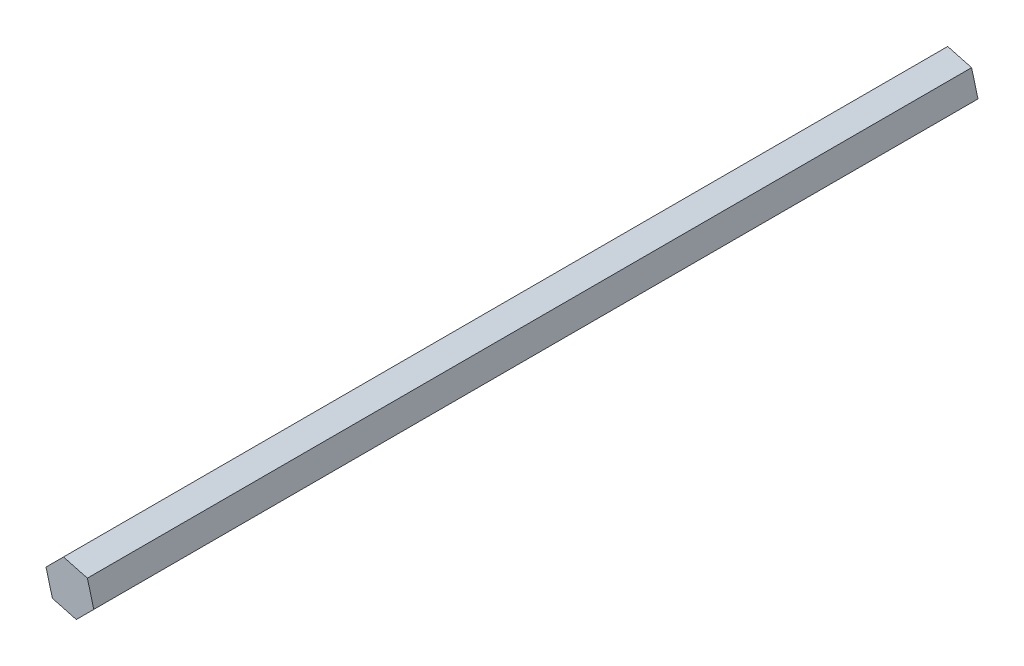
ISO-10303-21;
HEADER;
FILE_DESCRIPTION(('STEP AP214'),'2;1');
FILE_NAME('part.step','',(''),(''),'','','');
FILE_SCHEMA(('AUTOMOTIVE_DESIGN { 1 0 10303 214 1 1 1 1 }'));
ENDSEC;
DATA;
#1=APPLICATION_CONTEXT('core data for automotive mechanical design processes');
#2=APPLICATION_PROTOCOL_DEFINITION('international standard','automotive_design',2000,#1);
#3=PRODUCT_CONTEXT('',#1,'mechanical');
#4=PRODUCT('Part','Part','',(#3));
#5=PRODUCT_RELATED_PRODUCT_CATEGORY('part','',(#4));
#6=PRODUCT_DEFINITION_FORMATION('','',#4);
#7=PRODUCT_DEFINITION_CONTEXT('part definition',#1,'design');
#8=PRODUCT_DEFINITION('design','',#6,#7);
#9=PRODUCT_DEFINITION_SHAPE('','',#8);
#10=(LENGTH_UNIT() NAMED_UNIT(*) SI_UNIT(.MILLI.,.METRE.));
#11=(NAMED_UNIT(*) PLANE_ANGLE_UNIT() SI_UNIT($,.RADIAN.));
#12=(NAMED_UNIT(*) SI_UNIT($,.STERADIAN.) SOLID_ANGLE_UNIT());
#13=UNCERTAINTY_MEASURE_WITH_UNIT(LENGTH_MEASURE(1.E-05),#10,'distance_accuracy_value','');
#14=(GEOMETRIC_REPRESENTATION_CONTEXT(3) GLOBAL_UNCERTAINTY_ASSIGNED_CONTEXT((#13)) GLOBAL_UNIT_ASSIGNED_CONTEXT((#10,
#11,#12)) REPRESENTATION_CONTEXT('',''));
#15=CARTESIAN_POINT('',(0.,0.,0.));
#16=DIRECTION('',(0.,0.,1.));
#17=DIRECTION('',(1.,0.,0.));
#18=AXIS2_PLACEMENT_3D('',#15,#16,#17);
#19=CARTESIAN_POINT('',(3.40295474387526,-12.7,469.9));
#20=DIRECTION('',(-0.707106781186547,0.707106781186548,0.));
#21=DIRECTION('',(-0.707106781186548,-0.707106781186547,0.));
#22=AXIS2_PLACEMENT_3D('',#19,#20,#21);
#23=PLANE('',#22);
#24=DIRECTION('',(0.707106781186548,0.707106781186547,0.));
#25=VECTOR('',#24,1.);
#26=CARTESIAN_POINT('',(3.40295474387526,-12.7,0.));
#27=LINE('',#26,#25);
#28=CARTESIAN_POINT('',(3.40295474387526,-12.7,0.));
#29=VERTEX_POINT('',#28);
#30=CARTESIAN_POINT('',(12.7,-3.40295474387526,0.));
#31=VERTEX_POINT('',#30);
#32=EDGE_CURVE('E117',#29,#31,#27,.T.);
#33=ORIENTED_EDGE('',*,*,#32,.T.);
#34=DIRECTION('',(0.,0.,-1.));
#35=VECTOR('',#34,1.);
#36=CARTESIAN_POINT('',(12.7,-3.40295474387526,469.9));
#37=LINE('',#36,#35);
#38=CARTESIAN_POINT('',(12.7,-3.40295474387526,469.9));
#39=VERTEX_POINT('',#38);
#40=EDGE_CURVE('E11',#39,#31,#37,.T.);
#41=ORIENTED_EDGE('',*,*,#40,.F.);
#42=DIRECTION('',(0.707106781186548,0.707106781186547,0.));
#43=VECTOR('',#42,1.);
#44=CARTESIAN_POINT('',(3.40295474387526,-12.7,469.9));
#45=LINE('',#44,#43);
#46=CARTESIAN_POINT('',(3.40295474387526,-12.7,469.9));
#47=VERTEX_POINT('',#46);
#48=EDGE_CURVE('E127',#47,#39,#45,.T.);
#49=ORIENTED_EDGE('',*,*,#48,.F.);
#50=DIRECTION('',(0.,0.,-1.));
#51=VECTOR('',#50,1.);
#52=CARTESIAN_POINT('',(3.40295474387526,-12.7,469.9));
#53=LINE('',#52,#51);
#54=EDGE_CURVE('E113',#47,#29,#53,.T.);
#55=ORIENTED_EDGE('',*,*,#54,.T.);
#56=EDGE_LOOP('',(#33,#41,#49,#55));
#57=FACE_BOUND('',#56,.T.);
#58=ADVANCED_FACE('F33',(#57),#23,.F.);
#59=CARTESIAN_POINT('',(12.7,-3.40295474387526,469.9));
#60=DIRECTION('',(-0.965925826289069,-0.25881904510252,0.));
#61=DIRECTION('',(0.25881904510252,-0.965925826289069,0.));
#62=AXIS2_PLACEMENT_3D('',#59,#60,#61);
#63=PLANE('',#62);
#64=DIRECTION('',(-0.25881904510252,0.965925826289068,0.));
#65=VECTOR('',#64,1.);
#66=CARTESIAN_POINT('',(12.7,-3.40295474387526,0.));
#67=LINE('',#66,#65);
#68=CARTESIAN_POINT('',(9.29704525612475,9.29704525612474,0.));
#69=VERTEX_POINT('',#68);
#70=EDGE_CURVE('E120',#31,#69,#67,.T.);
#71=ORIENTED_EDGE('',*,*,#70,.T.);
#72=DIRECTION('',(0.,0.,-1.));
#73=VECTOR('',#72,1.);
#74=CARTESIAN_POINT('',(9.29704525612475,9.29704525612474,469.9));
#75=LINE('',#74,#73);
#76=CARTESIAN_POINT('',(9.29704525612475,9.29704525612474,469.9));
#77=VERTEX_POINT('',#76);
#78=EDGE_CURVE('E41',#77,#69,#75,.T.);
#79=ORIENTED_EDGE('',*,*,#78,.F.);
#80=DIRECTION('',(-0.25881904510252,0.965925826289068,0.));
#81=VECTOR('',#80,1.);
#82=CARTESIAN_POINT('',(12.7,-3.40295474387526,469.9));
#83=LINE('',#82,#81);
#84=EDGE_CURVE('E86',#39,#77,#83,.T.);
#85=ORIENTED_EDGE('',*,*,#84,.F.);
#86=ORIENTED_EDGE('',*,*,#40,.T.);
#87=EDGE_LOOP('',(#71,#79,#85,#86));
#88=FACE_BOUND('',#87,.T.);
#89=ADVANCED_FACE('F151',(#88),#63,.F.);
#90=CARTESIAN_POINT('',(9.29704525612475,9.29704525612474,469.9));
#91=DIRECTION('',(-0.258819045102521,-0.965925826289068,0.));
#92=DIRECTION('',(0.965925826289068,-0.258819045102521,0.));
#93=AXIS2_PLACEMENT_3D('',#90,#91,#92);
#94=PLANE('',#93);
#95=DIRECTION('',(-0.965925826289068,0.258819045102521,0.));
#96=VECTOR('',#95,1.);
#97=CARTESIAN_POINT('',(9.29704525612475,9.29704525612474,0.));
#98=LINE('',#97,#96);
#99=CARTESIAN_POINT('',(-3.40295474387525,12.7,0.));
#100=VERTEX_POINT('',#99);
#101=EDGE_CURVE('E122',#69,#100,#98,.T.);
#102=ORIENTED_EDGE('',*,*,#101,.T.);
#103=DIRECTION('',(0.,0.,-1.));
#104=VECTOR('',#103,1.);
#105=CARTESIAN_POINT('',(-3.40295474387525,12.7,469.9));
#106=LINE('',#105,#104);
#107=CARTESIAN_POINT('',(-3.40295474387525,12.7,469.9));
#108=VERTEX_POINT('',#107);
#109=EDGE_CURVE('E108',#108,#100,#106,.T.);
#110=ORIENTED_EDGE('',*,*,#109,.F.);
#111=DIRECTION('',(-0.965925826289068,0.258819045102521,0.));
#112=VECTOR('',#111,1.);
#113=CARTESIAN_POINT('',(9.29704525612475,9.29704525612474,469.9));
#114=LINE('',#113,#112);
#115=EDGE_CURVE('E99',#77,#108,#114,.T.);
#116=ORIENTED_EDGE('',*,*,#115,.F.);
#117=ORIENTED_EDGE('',*,*,#78,.T.);
#118=EDGE_LOOP('',(#102,#110,#116,#117));
#119=FACE_BOUND('',#118,.T.);
#120=ADVANCED_FACE('F133',(#119),#94,.F.);
#121=CARTESIAN_POINT('',(-3.40295474387525,12.7,469.9));
#122=DIRECTION('',(0.707106781186547,-0.707106781186548,0.));
#123=DIRECTION('',(0.707106781186548,0.707106781186547,0.));
#124=AXIS2_PLACEMENT_3D('',#121,#122,#123);
#125=PLANE('',#124);
#126=DIRECTION('',(-0.707106781186548,-0.707106781186547,0.));
#127=VECTOR('',#126,1.);
#128=CARTESIAN_POINT('',(-3.40295474387525,12.7,0.));
#129=LINE('',#128,#127);
#130=CARTESIAN_POINT('',(-12.7,3.40295474387526,0.));
#131=VERTEX_POINT('',#130);
#132=EDGE_CURVE('E107',#100,#131,#129,.T.);
#133=ORIENTED_EDGE('',*,*,#132,.T.);
#134=DIRECTION('',(0.,0.,-1.));
#135=VECTOR('',#134,1.);
#136=CARTESIAN_POINT('',(-12.7,3.40295474387526,469.9));
#137=LINE('',#136,#135);
#138=CARTESIAN_POINT('',(-12.7,3.40295474387526,469.9));
#139=VERTEX_POINT('',#138);
#140=EDGE_CURVE('E104',#139,#131,#137,.T.);
#141=ORIENTED_EDGE('',*,*,#140,.F.);
#142=DIRECTION('',(-0.707106781186548,-0.707106781186547,0.));
#143=VECTOR('',#142,1.);
#144=CARTESIAN_POINT('',(-3.40295474387525,12.7,469.9));
#145=LINE('',#144,#143);
#146=EDGE_CURVE('E93',#108,#139,#145,.T.);
#147=ORIENTED_EDGE('',*,*,#146,.F.);
#148=ORIENTED_EDGE('',*,*,#109,.T.);
#149=EDGE_LOOP('',(#133,#141,#147,#148));
#150=FACE_BOUND('',#149,.T.);
#151=ADVANCED_FACE('F105',(#150),#125,.F.);
#152=CARTESIAN_POINT('',(-12.7,3.40295474387526,469.9));
#153=DIRECTION('',(0.965925826289069,0.25881904510252,0.));
#154=DIRECTION('',(-0.25881904510252,0.965925826289069,0.));
#155=AXIS2_PLACEMENT_3D('',#152,#153,#154);
#156=PLANE('',#155);
#157=DIRECTION('',(0.25881904510252,-0.965925826289068,0.));
#158=VECTOR('',#157,1.);
#159=CARTESIAN_POINT('',(-12.7,3.40295474387526,0.));
#160=LINE('',#159,#158);
#161=CARTESIAN_POINT('',(-9.29704525612475,-9.29704525612473,0.));
#162=VERTEX_POINT('',#161);
#163=EDGE_CURVE('E72',#131,#162,#160,.T.);
#164=ORIENTED_EDGE('',*,*,#163,.T.);
#165=DIRECTION('',(0.,0.,-1.));
#166=VECTOR('',#165,1.);
#167=CARTESIAN_POINT('',(-9.29704525612475,-9.29704525612473,469.9));
#168=LINE('',#167,#166);
#169=CARTESIAN_POINT('',(-9.29704525612475,-9.29704525612473,469.9));
#170=VERTEX_POINT('',#169);
#171=EDGE_CURVE('E109',#170,#162,#168,.T.);
#172=ORIENTED_EDGE('',*,*,#171,.F.);
#173=DIRECTION('',(0.25881904510252,-0.965925826289068,0.));
#174=VECTOR('',#173,1.);
#175=CARTESIAN_POINT('',(-12.7,3.40295474387526,469.9));
#176=LINE('',#175,#174);
#177=EDGE_CURVE('E97',#139,#170,#176,.T.);
#178=ORIENTED_EDGE('',*,*,#177,.F.);
#179=ORIENTED_EDGE('',*,*,#140,.T.);
#180=EDGE_LOOP('',(#164,#172,#178,#179));
#181=FACE_BOUND('',#180,.T.);
#182=ADVANCED_FACE('F111',(#181),#156,.F.);
#183=CARTESIAN_POINT('',(-9.29704525612475,-9.29704525612473,469.9));
#184=DIRECTION('',(0.258819045102521,0.965925826289068,0.));
#185=DIRECTION('',(-0.965925826289068,0.258819045102521,0.));
#186=AXIS2_PLACEMENT_3D('',#183,#184,#185);
#187=PLANE('',#186);
#188=DIRECTION('',(0.965925826289068,-0.258819045102521,0.));
#189=VECTOR('',#188,1.);
#190=CARTESIAN_POINT('',(-9.29704525612475,-9.29704525612473,0.));
#191=LINE('',#190,#189);
#192=EDGE_CURVE('E78',#162,#29,#191,.T.);
#193=ORIENTED_EDGE('',*,*,#192,.T.);
#194=ORIENTED_EDGE('',*,*,#54,.F.);
#195=DIRECTION('',(0.965925826289068,-0.258819045102521,0.));
#196=VECTOR('',#195,1.);
#197=CARTESIAN_POINT('',(-9.29704525612475,-9.29704525612473,469.9));
#198=LINE('',#197,#196);
#199=EDGE_CURVE('E49',#170,#47,#198,.T.);
#200=ORIENTED_EDGE('',*,*,#199,.F.);
#201=ORIENTED_EDGE('',*,*,#171,.T.);
#202=EDGE_LOOP('',(#193,#194,#200,#201));
#203=FACE_BOUND('',#202,.T.);
#204=ADVANCED_FACE('F140',(#203),#187,.F.);
#205=CARTESIAN_POINT('',(0.,0.,469.9));
#206=DIRECTION('',(0.,0.,1.));
#207=DIRECTION('',(1.,0.,0.));
#208=AXIS2_PLACEMENT_3D('',#205,#206,#207);
#209=PLANE('',#208);
#210=ORIENTED_EDGE('',*,*,#48,.T.);
#211=ORIENTED_EDGE('',*,*,#84,.T.);
#212=ORIENTED_EDGE('',*,*,#115,.T.);
#213=ORIENTED_EDGE('',*,*,#146,.T.);
#214=ORIENTED_EDGE('',*,*,#177,.T.);
#215=ORIENTED_EDGE('',*,*,#199,.T.);
#216=EDGE_LOOP('',(#210,#211,#212,#213,#214,#215));
#217=FACE_BOUND('',#216,.T.);
#218=ADVANCED_FACE('F95',(#217),#209,.T.);
#219=CARTESIAN_POINT('',(0.,0.,0.));
#220=DIRECTION('',(0.,0.,1.));
#221=DIRECTION('',(1.,0.,0.));
#222=AXIS2_PLACEMENT_3D('',#219,#220,#221);
#223=PLANE('',#222);
#224=ORIENTED_EDGE('',*,*,#32,.F.);
#225=ORIENTED_EDGE('',*,*,#192,.F.);
#226=ORIENTED_EDGE('',*,*,#163,.F.);
#227=ORIENTED_EDGE('',*,*,#132,.F.);
#228=ORIENTED_EDGE('',*,*,#101,.F.);
#229=ORIENTED_EDGE('',*,*,#70,.F.);
#230=EDGE_LOOP('',(#224,#225,#226,#227,#228,#229));
#231=FACE_BOUND('',#230,.T.);
#232=ADVANCED_FACE('F136',(#231),#223,.F.);
#233=CLOSED_SHELL('',(#58,#89,#120,#151,#182,#204,#218,#232));
#234=MANIFOLD_SOLID_BREP('B2',#233);
#235=ADVANCED_BREP_SHAPE_REPRESENTATION('',(#18,#234),#14);
#236=SHAPE_DEFINITION_REPRESENTATION(#9,#235);
ENDSEC;
END-ISO-10303-21;
